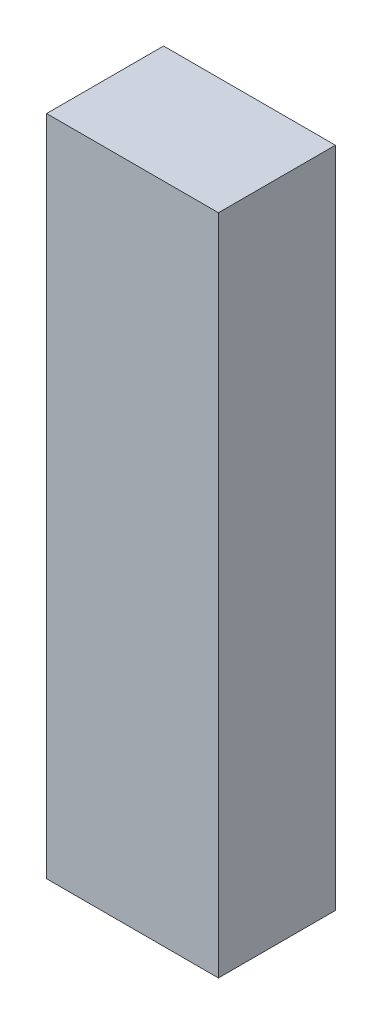
ISO-10303-21;
HEADER;
FILE_DESCRIPTION(('STEP AP214'),'2;1');
FILE_NAME('part.step','',(''),(''),'','','');
FILE_SCHEMA(('AUTOMOTIVE_DESIGN { 1 0 10303 214 1 1 1 1 }'));
ENDSEC;
DATA;
#1=APPLICATION_CONTEXT('core data for automotive mechanical design processes');
#2=APPLICATION_PROTOCOL_DEFINITION('international standard','automotive_design',2000,#1);
#3=PRODUCT_CONTEXT('',#1,'mechanical');
#4=PRODUCT('Part','Part','',(#3));
#5=PRODUCT_RELATED_PRODUCT_CATEGORY('part','',(#4));
#6=PRODUCT_DEFINITION_FORMATION('','',#4);
#7=PRODUCT_DEFINITION_CONTEXT('part definition',#1,'design');
#8=PRODUCT_DEFINITION('design','',#6,#7);
#9=PRODUCT_DEFINITION_SHAPE('','',#8);
#10=(LENGTH_UNIT() NAMED_UNIT(*) SI_UNIT(.MILLI.,.METRE.));
#11=(NAMED_UNIT(*) PLANE_ANGLE_UNIT() SI_UNIT($,.RADIAN.));
#12=(NAMED_UNIT(*) SI_UNIT($,.STERADIAN.) SOLID_ANGLE_UNIT());
#13=UNCERTAINTY_MEASURE_WITH_UNIT(LENGTH_MEASURE(1.E-05),#10,'distance_accuracy_value','');
#14=(GEOMETRIC_REPRESENTATION_CONTEXT(3) GLOBAL_UNCERTAINTY_ASSIGNED_CONTEXT((#13)) GLOBAL_UNIT_ASSIGNED_CONTEXT((#10,
#11,#12)) REPRESENTATION_CONTEXT('',''));
#15=CARTESIAN_POINT('',(0.,0.,0.));
#16=DIRECTION('',(0.,0.,1.));
#17=DIRECTION('',(1.,0.,0.));
#18=AXIS2_PLACEMENT_3D('',#15,#16,#17);
#19=CARTESIAN_POINT('',(0.,0.,-9.53));
#20=DIRECTION('',(-1.,0.,0.));
#21=DIRECTION('',(0.,-1.,0.));
#22=AXIS2_PLACEMENT_3D('',#19,#20,#21);
#23=PLANE('',#22);
#24=DIRECTION('',(0.,-1.,0.));
#25=VECTOR('',#24,1.);
#26=CARTESIAN_POINT('',(0.,0.,0.));
#27=LINE('',#26,#25);
#28=CARTESIAN_POINT('',(0.,0.,0.));
#29=VERTEX_POINT('',#28);
#30=CARTESIAN_POINT('',(0.,-54.,0.));
#31=VERTEX_POINT('',#30);
#32=EDGE_CURVE('E99',#29,#31,#27,.T.);
#33=ORIENTED_EDGE('',*,*,#32,.F.);
#34=DIRECTION('',(0.,0.,1.));
#35=VECTOR('',#34,1.);
#36=CARTESIAN_POINT('',(0.,0.,-9.53));
#37=LINE('',#36,#35);
#38=CARTESIAN_POINT('',(0.,0.,-9.53));
#39=VERTEX_POINT('',#38);
#40=EDGE_CURVE('E11',#39,#29,#37,.T.);
#41=ORIENTED_EDGE('',*,*,#40,.F.);
#42=DIRECTION('',(0.,-1.,0.));
#43=VECTOR('',#42,1.);
#44=CARTESIAN_POINT('',(0.,0.,-9.53));
#45=LINE('',#44,#43);
#46=CARTESIAN_POINT('',(0.,-54.,-9.53));
#47=VERTEX_POINT('',#46);
#48=EDGE_CURVE('E93',#39,#47,#45,.T.);
#49=ORIENTED_EDGE('',*,*,#48,.T.);
#50=DIRECTION('',(0.,0.,1.));
#51=VECTOR('',#50,1.);
#52=CARTESIAN_POINT('',(0.,-54.,-9.53));
#53=LINE('',#52,#51);
#54=EDGE_CURVE('E38',#47,#31,#53,.T.);
#55=ORIENTED_EDGE('',*,*,#54,.T.);
#56=EDGE_LOOP('',(#33,#41,#49,#55));
#57=FACE_BOUND('',#56,.T.);
#58=ADVANCED_FACE('F35',(#57),#23,.T.);
#59=CARTESIAN_POINT('',(0.,0.,-9.53));
#60=DIRECTION('',(0.,1.,0.));
#61=DIRECTION('',(0.,0.,1.));
#62=AXIS2_PLACEMENT_3D('',#59,#60,#61);
#63=PLANE('',#62);
#64=DIRECTION('',(-1.,0.,0.));
#65=VECTOR('',#64,1.);
#66=CARTESIAN_POINT('',(0.,0.,0.));
#67=LINE('',#66,#65);
#68=CARTESIAN_POINT('',(14.,0.,0.));
#69=VERTEX_POINT('',#68);
#70=EDGE_CURVE('E95',#69,#29,#67,.T.);
#71=ORIENTED_EDGE('',*,*,#70,.F.);
#72=DIRECTION('',(0.,0.,1.));
#73=VECTOR('',#72,1.);
#74=CARTESIAN_POINT('',(14.,0.,-9.53));
#75=LINE('',#74,#73);
#76=CARTESIAN_POINT('',(14.,0.,-9.53));
#77=VERTEX_POINT('',#76);
#78=EDGE_CURVE('E44',#77,#69,#75,.T.);
#79=ORIENTED_EDGE('',*,*,#78,.F.);
#80=DIRECTION('',(-1.,0.,0.));
#81=VECTOR('',#80,1.);
#82=CARTESIAN_POINT('',(0.,0.,-9.53));
#83=LINE('',#82,#81);
#84=EDGE_CURVE('E90',#77,#39,#83,.T.);
#85=ORIENTED_EDGE('',*,*,#84,.T.);
#86=ORIENTED_EDGE('',*,*,#40,.T.);
#87=EDGE_LOOP('',(#71,#79,#85,#86));
#88=FACE_BOUND('',#87,.T.);
#89=ADVANCED_FACE('F109',(#88),#63,.T.);
#90=CARTESIAN_POINT('',(14.,0.,-9.53));
#91=DIRECTION('',(1.,0.,0.));
#92=DIRECTION('',(0.,1.,0.));
#93=AXIS2_PLACEMENT_3D('',#90,#91,#92);
#94=PLANE('',#93);
#95=DIRECTION('',(0.,1.,0.));
#96=VECTOR('',#95,1.);
#97=CARTESIAN_POINT('',(14.,0.,0.));
#98=LINE('',#97,#96);
#99=CARTESIAN_POINT('',(14.,-54.,0.));
#100=VERTEX_POINT('',#99);
#101=EDGE_CURVE('E85',#100,#69,#98,.T.);
#102=ORIENTED_EDGE('',*,*,#101,.F.);
#103=DIRECTION('',(0.,0.,1.));
#104=VECTOR('',#103,1.);
#105=CARTESIAN_POINT('',(14.,-54.,-9.53));
#106=LINE('',#105,#104);
#107=CARTESIAN_POINT('',(14.,-54.,-9.53));
#108=VERTEX_POINT('',#107);
#109=EDGE_CURVE('E80',#108,#100,#106,.T.);
#110=ORIENTED_EDGE('',*,*,#109,.F.);
#111=DIRECTION('',(0.,1.,0.));
#112=VECTOR('',#111,1.);
#113=CARTESIAN_POINT('',(14.,0.,-9.53));
#114=LINE('',#113,#112);
#115=EDGE_CURVE('E83',#108,#77,#114,.T.);
#116=ORIENTED_EDGE('',*,*,#115,.T.);
#117=ORIENTED_EDGE('',*,*,#78,.T.);
#118=EDGE_LOOP('',(#102,#110,#116,#117));
#119=FACE_BOUND('',#118,.T.);
#120=ADVANCED_FACE('F82',(#119),#94,.T.);
#121=CARTESIAN_POINT('',(0.,-54.,-9.53));
#122=DIRECTION('',(0.,-1.,0.));
#123=DIRECTION('',(0.,0.,-1.));
#124=AXIS2_PLACEMENT_3D('',#121,#122,#123);
#125=PLANE('',#124);
#126=DIRECTION('',(1.,0.,0.));
#127=VECTOR('',#126,1.);
#128=CARTESIAN_POINT('',(0.,-54.,0.));
#129=LINE('',#128,#127);
#130=EDGE_CURVE('E102',#31,#100,#129,.T.);
#131=ORIENTED_EDGE('',*,*,#130,.F.);
#132=ORIENTED_EDGE('',*,*,#54,.F.);
#133=DIRECTION('',(1.,0.,0.));
#134=VECTOR('',#133,1.);
#135=CARTESIAN_POINT('',(0.,-54.,-9.53));
#136=LINE('',#135,#134);
#137=EDGE_CURVE('E89',#47,#108,#136,.T.);
#138=ORIENTED_EDGE('',*,*,#137,.T.);
#139=ORIENTED_EDGE('',*,*,#109,.T.);
#140=EDGE_LOOP('',(#131,#132,#138,#139));
#141=FACE_BOUND('',#140,.T.);
#142=ADVANCED_FACE('F92',(#141),#125,.T.);
#143=CARTESIAN_POINT('',(0.,0.,-9.53));
#144=DIRECTION('',(0.,0.,1.));
#145=DIRECTION('',(1.,0.,0.));
#146=AXIS2_PLACEMENT_3D('',#143,#144,#145);
#147=PLANE('',#146);
#148=ORIENTED_EDGE('',*,*,#48,.F.);
#149=ORIENTED_EDGE('',*,*,#84,.F.);
#150=ORIENTED_EDGE('',*,*,#115,.F.);
#151=ORIENTED_EDGE('',*,*,#137,.F.);
#152=EDGE_LOOP('',(#148,#149,#150,#151));
#153=FACE_BOUND('',#152,.T.);
#154=ADVANCED_FACE('F88',(#153),#147,.F.);
#155=CARTESIAN_POINT('',(0.,0.,0.));
#156=DIRECTION('',(0.,0.,1.));
#157=DIRECTION('',(1.,0.,0.));
#158=AXIS2_PLACEMENT_3D('',#155,#156,#157);
#159=PLANE('',#158);
#160=ORIENTED_EDGE('',*,*,#32,.T.);
#161=ORIENTED_EDGE('',*,*,#130,.T.);
#162=ORIENTED_EDGE('',*,*,#101,.T.);
#163=ORIENTED_EDGE('',*,*,#70,.T.);
#164=EDGE_LOOP('',(#160,#161,#162,#163));
#165=FACE_BOUND('',#164,.T.);
#166=ADVANCED_FACE('F108',(#165),#159,.T.);
#167=CLOSED_SHELL('',(#58,#89,#120,#142,#154,#166));
#168=MANIFOLD_SOLID_BREP('B2',#167);
#169=ADVANCED_BREP_SHAPE_REPRESENTATION('',(#18,#168),#14);
#170=SHAPE_DEFINITION_REPRESENTATION(#9,#169);
ENDSEC;
END-ISO-10303-21;
